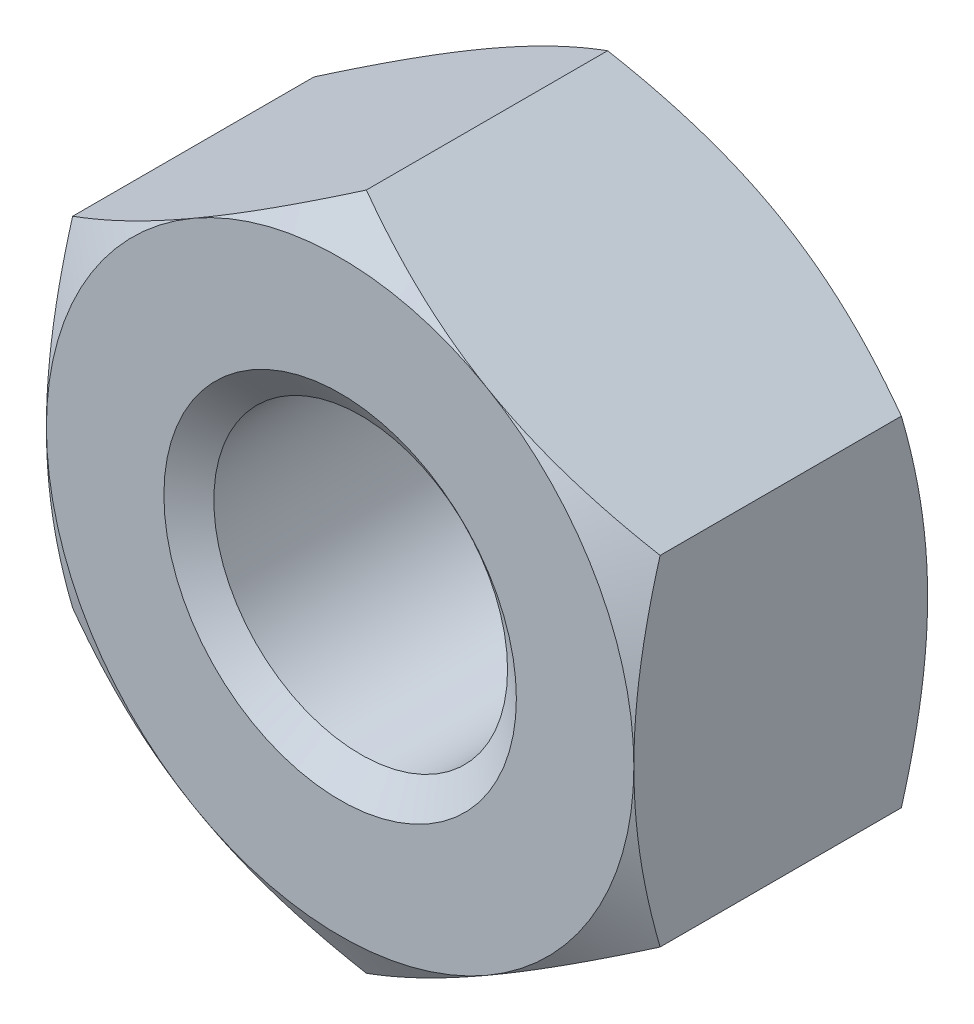
ISO-10303-21;
HEADER;
FILE_DESCRIPTION(('STEP AP214'),'2;1');
FILE_NAME('part.step','',(''),(''),'','','');
FILE_SCHEMA(('AUTOMOTIVE_DESIGN { 1 0 10303 214 1 1 1 1 }'));
ENDSEC;
DATA;
#1=APPLICATION_CONTEXT('core data for automotive mechanical design processes');
#2=APPLICATION_PROTOCOL_DEFINITION('international standard','automotive_design',2000,#1);
#3=PRODUCT_CONTEXT('',#1,'mechanical');
#4=PRODUCT('Part','Part','',(#3));
#5=PRODUCT_RELATED_PRODUCT_CATEGORY('part','',(#4));
#6=PRODUCT_DEFINITION_FORMATION('','',#4);
#7=PRODUCT_DEFINITION_CONTEXT('part definition',#1,'design');
#8=PRODUCT_DEFINITION('design','',#6,#7);
#9=PRODUCT_DEFINITION_SHAPE('','',#8);
#10=(LENGTH_UNIT() NAMED_UNIT(*) SI_UNIT(.MILLI.,.METRE.));
#11=(NAMED_UNIT(*) PLANE_ANGLE_UNIT() SI_UNIT($,.RADIAN.));
#12=(NAMED_UNIT(*) SI_UNIT($,.STERADIAN.) SOLID_ANGLE_UNIT());
#13=UNCERTAINTY_MEASURE_WITH_UNIT(LENGTH_MEASURE(1.E-05),#10,'distance_accuracy_value','');
#14=(GEOMETRIC_REPRESENTATION_CONTEXT(3) GLOBAL_UNCERTAINTY_ASSIGNED_CONTEXT((#13)) GLOBAL_UNIT_ASSIGNED_CONTEXT((#10,
#11,#12)) REPRESENTATION_CONTEXT('',''));
#15=CARTESIAN_POINT('',(0.,0.,0.));
#16=DIRECTION('',(0.,0.,1.));
#17=DIRECTION('',(1.,0.,0.));
#18=AXIS2_PLACEMENT_3D('',#15,#16,#17);
#19=CARTESIAN_POINT('',(0.,0.,-5.));
#20=DIRECTION('',(0.,0.,1.));
#21=DIRECTION('',(1.,0.,0.));
#22=AXIS2_PLACEMENT_3D('',#19,#20,#21);
#23=CYLINDRICAL_SURFACE('',#22,2.5);
#24=CARTESIAN_POINT('',(0.,0.,-0.350103769104855));
#25=DIRECTION('',(0.,0.,1.));
#26=DIRECTION('',(1.,0.,0.));
#27=AXIS2_PLACEMENT_3D('',#24,#25,#26);
#28=CIRCLE('',#27,2.5);
#29=CARTESIAN_POINT('',(2.5,0.,-0.350103769104855));
#30=VERTEX_POINT('',#29);
#31=EDGE_CURVE('E341',#30,#30,#28,.F.);
#32=ORIENTED_EDGE('',*,*,#31,.F.);
#33=EDGE_LOOP('',(#32));
#34=FACE_BOUND('',#33,.T.);
#35=CARTESIAN_POINT('',(0.,0.,-4.62449623089514));
#36=DIRECTION('',(0.,0.,-1.));
#37=DIRECTION('',(-1.,0.,0.));
#38=AXIS2_PLACEMENT_3D('',#35,#36,#37);
#39=CIRCLE('',#38,2.5);
#40=CARTESIAN_POINT('',(-2.5,0.,-4.62449623089514));
#41=VERTEX_POINT('',#40);
#42=EDGE_CURVE('E61',#41,#41,#39,.F.);
#43=ORIENTED_EDGE('',*,*,#42,.F.);
#44=EDGE_LOOP('',(#43));
#45=FACE_BOUND('',#44,.T.);
#46=ADVANCED_FACE('F55',(#34,#45),#23,.F.);
#47=CARTESIAN_POINT('',(0.,5.77350269189626,-5.));
#48=DIRECTION('',(-0.5,0.866025403784439,0.));
#49=DIRECTION('',(-0.866025403784439,-0.5,0.));
#50=AXIS2_PLACEMENT_3D('',#47,#48,#49);
#51=PLANE('',#50);
#52=DIRECTION('',(0.,0.,1.));
#53=VECTOR('',#52,1.);
#54=CARTESIAN_POINT('',(-5.,2.88675134594813,-5.));
#55=LINE('',#54,#53);
#56=CARTESIAN_POINT('',(-5.,2.88675134594813,-4.55341801261479));
#57=VERTEX_POINT('',#56);
#58=CARTESIAN_POINT('',(-5.,2.88675134594813,-0.446581987385205));
#59=VERTEX_POINT('',#58);
#60=EDGE_CURVE('E423',#57,#59,#55,.T.);
#61=ORIENTED_EDGE('',*,*,#60,.T.);
#62=CARTESIAN_POINT('',(-5.0002,2.88663587589429,-0.446648656051832));
#63=CARTESIAN_POINT('',(-4.78046540547482,3.01349970319368,-0.373386567637637));
#64=CARTESIAN_POINT('',(-4.55885141554042,3.14144859993849,-0.306751321918094));
#65=CARTESIAN_POINT('',(-4.11178600454649,3.39956193532121,-0.190438991010811));
#66=CARTESIAN_POINT('',(-3.88632664040922,3.52973095989718,-0.140803049915789));
#67=CARTESIAN_POINT('',(-3.43816769477649,3.78847564779798,-0.0635510254186974));
#68=CARTESIAN_POINT('',(-3.21553790689581,3.91701101576052,-0.0354203782834889));
#69=CARTESIAN_POINT('',(-2.88081009815336,4.11026620624323,-0.0101949219536839));
#70=CARTESIAN_POINT('',(-2.76915780319494,4.17472868879311,-0.00461345976948332));
#71=CARTESIAN_POINT('',(-2.5457500293262,4.30371322717528,0.000797783248530318));
#72=CARTESIAN_POINT('',(-2.43399455370968,4.36823528110589,0.000627741741796967));
#73=CARTESIAN_POINT('',(-2.12781576914936,4.54500768479195,-0.00775363179203663));
#74=CARTESIAN_POINT('',(-1.93349391403278,4.65719946015293,-0.0218297718972518));
#75=CARTESIAN_POINT('',(-1.54613989800229,4.88083840557981,-0.0664652571094316));
#76=CARTESIAN_POINT('',(-1.35310909862843,4.9922847895602,-0.0970398601475091));
#77=CARTESIAN_POINT('',(-0.964974657525143,5.21637431361295,-0.173468493621166));
#78=CARTESIAN_POINT('',(-0.769920001358262,5.32898917185759,-0.219646378878682));
#79=CARTESIAN_POINT('',(-0.38271965464123,5.55253939626498,-0.324451794491937));
#80=CARTESIAN_POINT('',(-0.190569004591912,5.66347762579592,-0.383054703437378));
#81=CARTESIAN_POINT('',(0.000200000000000614,5.7736181619501,-0.446648656051833));
#82=B_SPLINE_CURVE_WITH_KNOTS('',3,(#62,#63,#64,#65,#66,#67,#68,#69,#70,#71,#72,#73,#74,#75,#76,
#77,#78,#79,#80,#81),.UNSPECIFIED.,.F.,.F.,(4,2,2,2,2,2,2,2,2,4),(0.,0.792555841363092,
1.58701660053334,2.36181537487281,2.74884076077326,3.13585419177295,3.8096236259968,
4.4840172390119,5.17336882348929,5.86136694793725),.UNSPECIFIED.);
#83=CARTESIAN_POINT('',(-2.5,4.33012701892219,0.));
#84=VERTEX_POINT('',#83);
#85=EDGE_CURVE('E90',#59,#84,#82,.T.);
#86=ORIENTED_EDGE('',*,*,#85,.T.);
#87=CARTESIAN_POINT('',(0.,5.77350269189626,-0.446581987385206));
#88=VERTEX_POINT('',#87);
#89=EDGE_CURVE('E523',#84,#88,#82,.T.);
#90=ORIENTED_EDGE('',*,*,#89,.T.);
#91=DIRECTION('',(0.,0.,1.));
#92=VECTOR('',#91,1.);
#93=CARTESIAN_POINT('',(0.,5.77350269189626,-5.));
#94=LINE('',#93,#92);
#95=CARTESIAN_POINT('',(0.,5.77350269189626,-4.55341801261479));
#96=VERTEX_POINT('',#95);
#97=EDGE_CURVE('E200',#96,#88,#94,.T.);
#98=ORIENTED_EDGE('',*,*,#97,.F.);
#99=CARTESIAN_POINT('',(-5.0002,2.88663587589429,-4.55335134394817));
#100=CARTESIAN_POINT('',(-4.78046540547481,3.01349970319368,-4.62661343236236));
#101=CARTESIAN_POINT('',(-4.55885141554042,3.14144859993849,-4.69324867808191));
#102=CARTESIAN_POINT('',(-4.11178600454649,3.39956193532121,-4.80956100898919));
#103=CARTESIAN_POINT('',(-3.88632664040922,3.52973095989718,-4.85919695008421));
#104=CARTESIAN_POINT('',(-3.43816769477649,3.78847564779798,-4.9364489745813));
#105=CARTESIAN_POINT('',(-3.21553790689581,3.91701101576052,-4.96457962171651));
#106=CARTESIAN_POINT('',(-2.88081009815336,4.11026620624323,-4.98980507804632));
#107=CARTESIAN_POINT('',(-2.76915780319494,4.17472868879311,-4.99538654023052));
#108=CARTESIAN_POINT('',(-2.5457500293262,4.30371322717528,-5.00079778324853));
#109=CARTESIAN_POINT('',(-2.43399455370968,4.36823528110589,-5.0006277417418));
#110=CARTESIAN_POINT('',(-2.12781576914936,4.54500768479195,-4.99224636820796));
#111=CARTESIAN_POINT('',(-1.93349391403278,4.65719946015293,-4.97817022810275));
#112=CARTESIAN_POINT('',(-1.54613989800229,4.88083840557981,-4.93353474289057));
#113=CARTESIAN_POINT('',(-1.35310909862843,4.9922847895602,-4.90296013985249));
#114=CARTESIAN_POINT('',(-0.964974657525144,5.21637431361295,-4.82653150637883));
#115=CARTESIAN_POINT('',(-0.769920001358262,5.32898917185759,-4.78035362112132));
#116=CARTESIAN_POINT('',(-0.38271965464123,5.55253939626498,-4.67554820550806));
#117=CARTESIAN_POINT('',(-0.190569004591912,5.66347762579592,-4.61694529656262));
#118=CARTESIAN_POINT('',(0.000200000000000359,5.7736181619501,-4.55335134394817));
#119=B_SPLINE_CURVE_WITH_KNOTS('',3,(#99,#100,#101,#102,#103,#104,#105,#106,#107,#108,#109,#110,
#111,#112,#113,#114,#115,#116,#117,#118),.UNSPECIFIED.,.F.,.F.,(4,2,2,2,2,2,2,2,2,4),(0.,
0.792555841363092,1.58701660053334,2.36181537487281,2.74884076077326,3.13585419177295,
3.8096236259968,4.4840172390119,5.17336882348929,5.86136694793726),.UNSPECIFIED.);
#120=CARTESIAN_POINT('',(-2.5,4.33012701892219,-5.));
#121=VERTEX_POINT('',#120);
#122=EDGE_CURVE('E429',#121,#96,#119,.T.);
#123=ORIENTED_EDGE('',*,*,#122,.F.);
#124=EDGE_CURVE('E446',#57,#121,#119,.T.);
#125=ORIENTED_EDGE('',*,*,#124,.F.);
#126=EDGE_LOOP('',(#61,#86,#90,#98,#123,#125));
#127=FACE_BOUND('',#126,.T.);
#128=ADVANCED_FACE('F58',(#127),#51,.T.);
#129=CARTESIAN_POINT('',(5.,2.88675134594813,-5.));
#130=DIRECTION('',(0.500000000000001,0.866025403784438,0.));
#131=DIRECTION('',(-0.866025403784438,0.500000000000001,0.));
#132=AXIS2_PLACEMENT_3D('',#129,#130,#131);
#133=PLANE('',#132);
#134=ORIENTED_EDGE('',*,*,#97,.T.);
#135=CARTESIAN_POINT('',(-0.000199999999999281,5.7736181619501,-0.446648656051833));
#136=CARTESIAN_POINT('',(0.219534594525186,5.64675433465071,-0.373386567637638));
#137=CARTESIAN_POINT('',(0.441148584459582,5.5188054379059,-0.306751321918095));
#138=CARTESIAN_POINT('',(0.888213995453515,5.26069210252318,-0.190438991010812));
#139=CARTESIAN_POINT('',(1.11367335959078,5.13052307794721,-0.14080304991579));
#140=CARTESIAN_POINT('',(1.56183230522351,4.87177839004641,-0.063551025418698));
#141=CARTESIAN_POINT('',(1.7844620931042,4.74324302208387,-0.0354203782834893));
#142=CARTESIAN_POINT('',(2.11918990184665,4.54998783160116,-0.0101949219536843));
#143=CARTESIAN_POINT('',(2.23084219680507,4.48552534905128,-0.00461345976948372));
#144=CARTESIAN_POINT('',(2.4542499706738,4.35654081066911,0.000797783248529964));
#145=CARTESIAN_POINT('',(2.56600544629032,4.2920187567385,0.000627741741796721));
#146=CARTESIAN_POINT('',(2.87218423085064,4.11524635305244,-0.00775363179203655));
#147=CARTESIAN_POINT('',(3.06650608596722,4.00305457769146,-0.0218297718972515));
#148=CARTESIAN_POINT('',(3.45386010199771,3.77941563226457,-0.0664652571094311));
#149=CARTESIAN_POINT('',(3.64689090137157,3.66796924828418,-0.0970398601475088));
#150=CARTESIAN_POINT('',(4.03502534247486,3.44387972423144,-0.173468493621165));
#151=CARTESIAN_POINT('',(4.23007999864174,3.3312648659868,-0.219646378878681));
#152=CARTESIAN_POINT('',(4.61728034535877,3.1077146415794,-0.324451794491936));
#153=CARTESIAN_POINT('',(4.80943099540809,2.99677641204847,-0.383054703437376));
#154=CARTESIAN_POINT('',(5.0002,2.88663587589429,-0.446648656051831));
#155=B_SPLINE_CURVE_WITH_KNOTS('',3,(#135,#136,#137,#138,#139,#140,#141,#142,#143,#144,#145,
#146,#147,#148,#149,#150,#151,#152,#153,#154),.UNSPECIFIED.,.F.,.F.,(4,2,2,2,2,2,2,2,2,4),(0.,
0.792555841363092,1.58701660053334,2.36181537487281,2.74884076077326,3.13585419177295,
3.8096236259968,4.4840172390119,5.17336882348929,5.86136694793725),.UNSPECIFIED.);
#156=CARTESIAN_POINT('',(2.5,4.33012701892219,0.));
#157=VERTEX_POINT('',#156);
#158=EDGE_CURVE('E191',#88,#157,#155,.T.);
#159=ORIENTED_EDGE('',*,*,#158,.T.);
#160=CARTESIAN_POINT('',(5.,2.88675134594813,-0.446581987385206));
#161=VERTEX_POINT('',#160);
#162=EDGE_CURVE('E176',#157,#161,#155,.T.);
#163=ORIENTED_EDGE('',*,*,#162,.T.);
#164=DIRECTION('',(0.,0.,1.));
#165=VECTOR('',#164,1.);
#166=CARTESIAN_POINT('',(5.,2.88675134594813,-5.));
#167=LINE('',#166,#165);
#168=CARTESIAN_POINT('',(5.,2.88675134594813,-4.55341801261479));
#169=VERTEX_POINT('',#168);
#170=EDGE_CURVE('E190',#169,#161,#167,.T.);
#171=ORIENTED_EDGE('',*,*,#170,.F.);
#172=CARTESIAN_POINT('',(-0.000199999999999266,5.7736181619501,-4.55335134394817));
#173=CARTESIAN_POINT('',(0.219534594525186,5.64675433465071,-4.62661343236236));
#174=CARTESIAN_POINT('',(0.441148584459582,5.5188054379059,-4.6932486780819));
#175=CARTESIAN_POINT('',(0.888213995453515,5.26069210252318,-4.80956100898919));
#176=CARTESIAN_POINT('',(1.11367335959078,5.13052307794721,-4.85919695008421));
#177=CARTESIAN_POINT('',(1.56183230522351,4.87177839004641,-4.9364489745813));
#178=CARTESIAN_POINT('',(1.78446209310419,4.74324302208387,-4.96457962171651));
#179=CARTESIAN_POINT('',(2.11918990184664,4.54998783160116,-4.98980507804631));
#180=CARTESIAN_POINT('',(2.23084219680506,4.48552534905128,-4.99538654023052));
#181=CARTESIAN_POINT('',(2.4542499706738,4.35654081066911,-5.00079778324853));
#182=CARTESIAN_POINT('',(2.56600544629032,4.2920187567385,-5.0006277417418));
#183=CARTESIAN_POINT('',(2.87218423085064,4.11524635305244,-4.99224636820796));
#184=CARTESIAN_POINT('',(3.06650608596722,4.00305457769146,-4.97817022810275));
#185=CARTESIAN_POINT('',(3.45386010199771,3.77941563226457,-4.93353474289057));
#186=CARTESIAN_POINT('',(3.64689090137157,3.66796924828418,-4.90296013985249));
#187=CARTESIAN_POINT('',(4.03502534247485,3.44387972423144,-4.82653150637883));
#188=CARTESIAN_POINT('',(4.23007999864174,3.3312648659868,-4.78035362112132));
#189=CARTESIAN_POINT('',(4.61728034535877,3.1077146415794,-4.67554820550806));
#190=CARTESIAN_POINT('',(4.80943099540809,2.99677641204847,-4.61694529656262));
#191=CARTESIAN_POINT('',(5.0002,2.88663587589429,-4.55335134394817));
#192=B_SPLINE_CURVE_WITH_KNOTS('',3,(#172,#173,#174,#175,#176,#177,#178,#179,#180,#181,#182,
#183,#184,#185,#186,#187,#188,#189,#190,#191),.UNSPECIFIED.,.F.,.F.,(4,2,2,2,2,2,2,2,2,4),(0.,
0.792555841363092,1.58701660053334,2.36181537487281,2.74884076077326,3.13585419177295,
3.8096236259968,4.4840172390119,5.17336882348929,5.86136694793725),.UNSPECIFIED.);
#193=CARTESIAN_POINT('',(2.5,4.33012701892219,-5.));
#194=VERTEX_POINT('',#193);
#195=EDGE_CURVE('E404',#194,#169,#192,.T.);
#196=ORIENTED_EDGE('',*,*,#195,.F.);
#197=EDGE_CURVE('E508',#96,#194,#192,.T.);
#198=ORIENTED_EDGE('',*,*,#197,.F.);
#199=EDGE_LOOP('',(#134,#159,#163,#171,#196,#198));
#200=FACE_BOUND('',#199,.T.);
#201=ADVANCED_FACE('F188',(#200),#133,.T.);
#202=CARTESIAN_POINT('',(5.,2.88675134594813,-5.));
#203=DIRECTION('',(-1.,0.,0.));
#204=DIRECTION('',(0.,0.,1.));
#205=AXIS2_PLACEMENT_3D('',#202,#203,#204);
#206=PLANE('',#205);
#207=CARTESIAN_POINT('',(5.,-7.65608998744865,-2.3926335265508));
#208=CARTESIAN_POINT('',(5.,-7.43656171400166,-2.28654533817207));
#209=CARTESIAN_POINT('',(5.,-7.21651440170022,-2.18151175461596));
#210=CARTESIAN_POINT('',(5.,-6.77510105921518,-1.97415643363976));
#211=CARTESIAN_POINT('',(5.,-6.55373480873053,-1.87183516574569));
#212=CARTESIAN_POINT('',(5.,-6.10820714710357,-1.66996807853491));
#213=CARTESIAN_POINT('',(5.,-5.88403698971124,-1.57044149281731));
#214=CARTESIAN_POINT('',(5.,-5.43385418074677,-1.37566323278682));
#215=CARTESIAN_POINT('',(5.,-5.20784162594278,-1.28041133564243));
#216=CARTESIAN_POINT('',(5.,-4.75080884782756,-1.09418830918942));
#217=CARTESIAN_POINT('',(5.,-4.51976121099505,-1.0032840909987));
#218=CARTESIAN_POINT('',(5.,-4.054940534221,-0.828595302971951));
#219=CARTESIAN_POINT('',(5.,-3.82116719434025,-0.744811525247653));
#220=CARTESIAN_POINT('',(5.,-3.35100416711889,-0.58661463236462));
#221=CARTESIAN_POINT('',(5.,-3.11462125088188,-0.512181595225271));
#222=CARTESIAN_POINT('',(5.,-2.63849247870023,-0.375104393872377));
#223=CARTESIAN_POINT('',(5.,-2.3987477121033,-0.312456501596949));
#224=CARTESIAN_POINT('',(5.,-1.91574303714497,-0.201987753994869));
#225=CARTESIAN_POINT('',(5.,-1.672482210841,-0.154170846558642));
#226=CARTESIAN_POINT('',(5.,-1.18299359688664,-0.0765955557924025));
#227=CARTESIAN_POINT('',(5.,-0.936765806613278,-0.0468371884284092));
#228=CARTESIAN_POINT('',(5.,-0.567032279323844,-0.0176512015862964));
#229=CARTESIAN_POINT('',(5.,-0.444105297658536,-0.0104963190599469));
#230=CARTESIAN_POINT('',(5.,-0.198053005238562,-0.00139545226904073));
#231=CARTESIAN_POINT('',(5.,-0.0749276970802251,0.000550599639614557));
#232=CARTESIAN_POINT('',(5.,0.171257999892357,-0.000818470345664077));
#233=CARTESIAN_POINT('',(5.,0.294318397227092,-0.00413211431301171));
#234=CARTESIAN_POINT('',(5.,0.540192730788844,-0.0159365972827602));
#235=CARTESIAN_POINT('',(5.,0.663006654263487,-0.0244276975701651));
#236=CARTESIAN_POINT('',(5.,0.960681872881669,-0.0511063802753011));
#237=CARTESIAN_POINT('',(5.,1.1353143627994,-0.0718889676982867));
#238=CARTESIAN_POINT('',(5.,1.48321675799389,-0.122765655722695));
#239=CARTESIAN_POINT('',(5.,1.65648647841236,-0.152860997990034));
#240=CARTESIAN_POINT('',(5.,2.00155426058699,-0.221298792011551));
#241=CARTESIAN_POINT('',(5.,2.17335067370373,-0.259649477486405));
#242=CARTESIAN_POINT('',(5.,2.51518168221054,-0.343428305385012));
#243=CARTESIAN_POINT('',(5.,2.6852163841931,-0.388856016914002));
#244=CARTESIAN_POINT('',(5.,3.02770318928892,-0.486887782054293));
#245=CARTESIAN_POINT('',(5.,3.20011248435312,-0.539640363823942));
#246=CARTESIAN_POINT('',(5.,3.54310870430177,-0.650357787302626));
#247=CARTESIAN_POINT('',(5.,3.71369679659714,-0.70831903390707));
#248=CARTESIAN_POINT('',(5.,4.05236610267974,-0.828256540728474));
#249=CARTESIAN_POINT('',(5.,4.22045602230056,-0.890208365426365));
#250=CARTESIAN_POINT('',(5.,4.55533171687448,-1.01774823413812));
#251=CARTESIAN_POINT('',(5.,4.72211693321415,-1.08333774778777));
#252=CARTESIAN_POINT('',(5.,4.88829623733356,-1.15038625817724));
#253=B_SPLINE_CURVE_WITH_KNOTS('',3,(#207,#208,#209,#210,#211,#212,#213,#214,#215,#216,#217,
#218,#219,#220,#221,#222,#223,#224,#225,#226,#227,#228,#229,#230,#231,#232,#233,#234,#235,#236,
#237,#238,#239,#240,#241,#242,#243,#244,#245,#246,#247,#248,#249,#250,#251,#252),.UNSPECIFIED.,
.F.,.F.,(4,2,2,2,2,2,2,2,2,2,2,2,2,2,2,2,2,2,2,2,2,2,4),(0.,0.731464740665351,1.46305528824908,
2.19883243307486,2.93457117856033,3.67934251246858,4.42419659013361,5.1674358087199,
5.91043951739339,6.65364083834807,7.39684281638516,7.76615414335457,8.13546067426611,
8.50466345177856,8.87388486298453,9.40118542949727,9.92855633110015,10.4564556797854,
10.9843228991235,11.525120280828,12.065547221064,12.6029322754131,13.1405360390026),.UNSPECIFIED.);
#254=CARTESIAN_POINT('',(5.,-2.88675134594813,-0.446581987385206));
#255=VERTEX_POINT('',#254);
#256=CARTESIAN_POINT('',(5.,0.,0.));
#257=VERTEX_POINT('',#256);
#258=EDGE_CURVE('E183',#255,#257,#253,.T.);
#259=ORIENTED_EDGE('',*,*,#258,.F.);
#260=DIRECTION('',(0.,0.,1.));
#261=VECTOR('',#260,1.);
#262=CARTESIAN_POINT('',(5.,-2.88675134594813,-5.));
#263=LINE('',#262,#261);
#264=CARTESIAN_POINT('',(5.,-2.88675134594813,-4.55341801261479));
#265=VERTEX_POINT('',#264);
#266=EDGE_CURVE('E201',#265,#255,#263,.T.);
#267=ORIENTED_EDGE('',*,*,#266,.F.);
#268=CARTESIAN_POINT('',(5.,-7.65608998744865,-2.6073664734492));
#269=CARTESIAN_POINT('',(5.,-7.43656171400166,-2.71345466182792));
#270=CARTESIAN_POINT('',(5.,-7.21651440170021,-2.81848824538404));
#271=CARTESIAN_POINT('',(5.,-6.77510105921518,-3.02584356636023));
#272=CARTESIAN_POINT('',(5.,-6.55373480873052,-3.12816483425431));
#273=CARTESIAN_POINT('',(5.,-6.10820714710357,-3.33003192146509));
#274=CARTESIAN_POINT('',(5.,-5.88403698971124,-3.42955850718269));
#275=CARTESIAN_POINT('',(5.,-5.43385418074677,-3.62433676721318));
#276=CARTESIAN_POINT('',(5.,-5.20784162594278,-3.71958866435757));
#277=CARTESIAN_POINT('',(5.,-4.75080884782755,-3.90581169081058));
#278=CARTESIAN_POINT('',(5.,-4.51976121099505,-3.9967159090013));
#279=CARTESIAN_POINT('',(5.,-4.05494053422099,-4.17140469702805));
#280=CARTESIAN_POINT('',(5.,-3.82116719434024,-4.25518847475235));
#281=CARTESIAN_POINT('',(5.,-3.35100416711889,-4.41338536763538));
#282=CARTESIAN_POINT('',(5.,-3.11462125088187,-4.48781840477473));
#283=CARTESIAN_POINT('',(5.,-2.63849247870023,-4.62489560612762));
#284=CARTESIAN_POINT('',(5.,-2.3987477121033,-4.68754349840305));
#285=CARTESIAN_POINT('',(5.,-1.91574303714497,-4.79801224600513));
#286=CARTESIAN_POINT('',(5.,-1.672482210841,-4.84582915344136));
#287=CARTESIAN_POINT('',(5.,-1.18299359688664,-4.9234044442076));
#288=CARTESIAN_POINT('',(5.,-0.936765806613279,-4.95316281157159));
#289=CARTESIAN_POINT('',(5.,-0.567032279323846,-4.9823487984137));
#290=CARTESIAN_POINT('',(5.,-0.444105297658537,-4.98950368094005));
#291=CARTESIAN_POINT('',(5.,-0.198053005238563,-4.99860454773096));
#292=CARTESIAN_POINT('',(5.,-0.0749276970802267,-5.00055059963961));
#293=CARTESIAN_POINT('',(5.,0.171257999892355,-4.99918152965434));
#294=CARTESIAN_POINT('',(5.,0.29431839722709,-4.99586788568699));
#295=CARTESIAN_POINT('',(5.,0.540192730788843,-4.98406340271724));
#296=CARTESIAN_POINT('',(5.,0.663006654263486,-4.97557230242983));
#297=CARTESIAN_POINT('',(5.,0.960681872881669,-4.9488936197247));
#298=CARTESIAN_POINT('',(5.,1.1353143627994,-4.92811103230171));
#299=CARTESIAN_POINT('',(5.,1.48321675799389,-4.8772343442773));
#300=CARTESIAN_POINT('',(5.,1.65648647841236,-4.84713900200996));
#301=CARTESIAN_POINT('',(5.,2.00155426058699,-4.77870120798845));
#302=CARTESIAN_POINT('',(5.,2.17335067370373,-4.74035052251359));
#303=CARTESIAN_POINT('',(5.,2.51518168221054,-4.65657169461499));
#304=CARTESIAN_POINT('',(5.,2.6852163841931,-4.611143983086));
#305=CARTESIAN_POINT('',(5.,3.02770318928892,-4.51311221794571));
#306=CARTESIAN_POINT('',(5.,3.20011248435312,-4.46035963617606));
#307=CARTESIAN_POINT('',(5.,3.54310870430177,-4.34964221269737));
#308=CARTESIAN_POINT('',(5.,3.71369679659714,-4.29168096609293));
#309=CARTESIAN_POINT('',(5.,4.05236610267973,-4.17174345927153));
#310=CARTESIAN_POINT('',(5.,4.22045602230055,-4.10979163457363));
#311=CARTESIAN_POINT('',(5.,4.55533171687448,-3.98225176586188));
#312=CARTESIAN_POINT('',(5.,4.72211693321414,-3.91666225221223));
#313=CARTESIAN_POINT('',(5.,4.88829623733355,-3.84961374182276));
#314=B_SPLINE_CURVE_WITH_KNOTS('',3,(#268,#269,#270,#271,#272,#273,#274,#275,#276,#277,#278,
#279,#280,#281,#282,#283,#284,#285,#286,#287,#288,#289,#290,#291,#292,#293,#294,#295,#296,#297,
#298,#299,#300,#301,#302,#303,#304,#305,#306,#307,#308,#309,#310,#311,#312,#313),.UNSPECIFIED.,
.F.,.F.,(4,2,2,2,2,2,2,2,2,2,2,2,2,2,2,2,2,2,2,2,2,2,4),(0.,0.731464740665352,1.46305528824909,
2.19883243307486,2.93457117856034,3.67934251246858,4.42419659013362,5.1674358087199,
5.91043951739339,6.65364083834806,7.39684281638516,7.76615414335456,8.13546067426611,
8.50466345177856,8.87388486298453,9.40118542949727,9.92855633110015,10.4564556797854,
10.9843228991235,11.525120280828,12.065547221064,12.6029322754131,13.1405360390026),.UNSPECIFIED.);
#315=CARTESIAN_POINT('',(5.,0.,-5.));
#316=VERTEX_POINT('',#315);
#317=EDGE_CURVE('E452',#265,#316,#314,.T.);
#318=ORIENTED_EDGE('',*,*,#317,.T.);
#319=EDGE_CURVE('E198',#316,#169,#314,.T.);
#320=ORIENTED_EDGE('',*,*,#319,.T.);
#321=ORIENTED_EDGE('',*,*,#170,.T.);
#322=EDGE_CURVE('E173',#257,#161,#253,.T.);
#323=ORIENTED_EDGE('',*,*,#322,.F.);
#324=EDGE_LOOP('',(#259,#267,#318,#320,#321,#323));
#325=FACE_BOUND('',#324,.T.);
#326=ADVANCED_FACE('F195',(#325),#206,.F.);
#327=CARTESIAN_POINT('',(0.,-5.77350269189626,-5.));
#328=DIRECTION('',(0.5,-0.866025403784439,0.));
#329=DIRECTION('',(0.866025403784439,0.5,0.));
#330=AXIS2_PLACEMENT_3D('',#327,#328,#329);
#331=PLANE('',#330);
#332=ORIENTED_EDGE('',*,*,#266,.T.);
#333=CARTESIAN_POINT('',(5.0002,-2.88663587589429,-0.446648656051833));
#334=CARTESIAN_POINT('',(4.78046540547482,-3.01349970319368,-0.373386567637639));
#335=CARTESIAN_POINT('',(4.55885141554042,-3.14144859993849,-0.306751321918095));
#336=CARTESIAN_POINT('',(4.11178600454649,-3.39956193532121,-0.190438991010813));
#337=CARTESIAN_POINT('',(3.88632664040922,-3.52973095989718,-0.14080304991579));
#338=CARTESIAN_POINT('',(3.43816769477649,-3.78847564779798,-0.0635510254186991));
#339=CARTESIAN_POINT('',(3.2155379068958,-3.91701101576052,-0.0354203782834908));
#340=CARTESIAN_POINT('',(2.88081009815336,-4.11026620624323,-0.0101949219536858));
#341=CARTESIAN_POINT('',(2.76915780319494,-4.17472868879311,-0.00461345976948508));
#342=CARTESIAN_POINT('',(2.5457500293262,-4.30371322717528,0.000797783248528572));
#343=CARTESIAN_POINT('',(2.43399455370968,-4.36823528110589,0.000627741741795142));
#344=CARTESIAN_POINT('',(2.12781576914936,-4.54500768479195,-0.00775363179203859));
#345=CARTESIAN_POINT('',(1.93349391403278,-4.65719946015293,-0.0218297718972538));
#346=CARTESIAN_POINT('',(1.54613989800229,-4.88083840557982,-0.0664652571094336));
#347=CARTESIAN_POINT('',(1.35310909862843,-4.99228478956021,-0.0970398601475113));
#348=CARTESIAN_POINT('',(0.964974657525143,-5.21637431361295,-0.173468493621168));
#349=CARTESIAN_POINT('',(0.769920001358262,-5.32898917185759,-0.219646378878685));
#350=CARTESIAN_POINT('',(0.38271965464123,-5.55253939626499,-0.32445179449194));
#351=CARTESIAN_POINT('',(0.190569004591912,-5.66347762579592,-0.38305470343738));
#352=CARTESIAN_POINT('',(-0.000200000000000662,-5.7736181619501,-0.446648656051835));
#353=B_SPLINE_CURVE_WITH_KNOTS('',3,(#333,#334,#335,#336,#337,#338,#339,#340,#341,#342,#343,
#344,#345,#346,#347,#348,#349,#350,#351,#352),.UNSPECIFIED.,.F.,.F.,(4,2,2,2,2,2,2,2,2,4),(0.,
0.792555841363091,1.58701660053334,2.36181537487281,2.74884076077326,3.13585419177295,
3.8096236259968,4.4840172390119,5.17336882348929,5.86136694793725),.UNSPECIFIED.);
#354=CARTESIAN_POINT('',(2.5,-4.33012701892219,0.));
#355=VERTEX_POINT('',#354);
#356=EDGE_CURVE('E233',#255,#355,#353,.T.);
#357=ORIENTED_EDGE('',*,*,#356,.T.);
#358=CARTESIAN_POINT('',(0.,-5.77350269189626,-0.446581987385206));
#359=VERTEX_POINT('',#358);
#360=EDGE_CURVE('E234',#355,#359,#353,.T.);
#361=ORIENTED_EDGE('',*,*,#360,.T.);
#362=DIRECTION('',(0.,0.,1.));
#363=VECTOR('',#362,1.);
#364=CARTESIAN_POINT('',(0.,-5.77350269189626,-5.));
#365=LINE('',#364,#363);
#366=CARTESIAN_POINT('',(0.,-5.77350269189626,-4.55341801261479));
#367=VERTEX_POINT('',#366);
#368=EDGE_CURVE('E210',#367,#359,#365,.T.);
#369=ORIENTED_EDGE('',*,*,#368,.F.);
#370=CARTESIAN_POINT('',(5.0002,-2.88663587589429,-4.55335134394817));
#371=CARTESIAN_POINT('',(4.78046540547481,-3.01349970319368,-4.62661343236236));
#372=CARTESIAN_POINT('',(4.55885141554042,-3.14144859993849,-4.6932486780819));
#373=CARTESIAN_POINT('',(4.11178600454649,-3.39956193532121,-4.80956100898919));
#374=CARTESIAN_POINT('',(3.88632664040923,-3.52973095989718,-4.85919695008421));
#375=CARTESIAN_POINT('',(3.43816769477649,-3.78847564779798,-4.9364489745813));
#376=CARTESIAN_POINT('',(3.21553790689581,-3.91701101576052,-4.96457962171651));
#377=CARTESIAN_POINT('',(2.88081009815336,-4.11026620624323,-4.98980507804631));
#378=CARTESIAN_POINT('',(2.76915780319494,-4.17472868879311,-4.99538654023052));
#379=CARTESIAN_POINT('',(2.5457500293262,-4.30371322717528,-5.00079778324853));
#380=CARTESIAN_POINT('',(2.43399455370968,-4.36823528110589,-5.00062774174179));
#381=CARTESIAN_POINT('',(2.12781576914936,-4.54500768479195,-4.99224636820796));
#382=CARTESIAN_POINT('',(1.93349391403278,-4.65719946015293,-4.97817022810275));
#383=CARTESIAN_POINT('',(1.54613989800229,-4.88083840557982,-4.93353474289056));
#384=CARTESIAN_POINT('',(1.35310909862843,-4.99228478956021,-4.90296013985249));
#385=CARTESIAN_POINT('',(0.964974657525143,-5.21637431361295,-4.82653150637883));
#386=CARTESIAN_POINT('',(0.769920001358262,-5.32898917185759,-4.78035362112131));
#387=CARTESIAN_POINT('',(0.38271965464123,-5.55253939626499,-4.67554820550806));
#388=CARTESIAN_POINT('',(0.190569004591912,-5.66347762579592,-4.61694529656262));
#389=CARTESIAN_POINT('',(-0.000200000000000445,-5.7736181619501,-4.55335134394816));
#390=B_SPLINE_CURVE_WITH_KNOTS('',3,(#370,#371,#372,#373,#374,#375,#376,#377,#378,#379,#380,
#381,#382,#383,#384,#385,#386,#387,#388,#389),.UNSPECIFIED.,.F.,.F.,(4,2,2,2,2,2,2,2,2,4),(0.,
0.792555841363092,1.58701660053334,2.36181537487281,2.74884076077326,3.13585419177295,
3.8096236259968,4.4840172390119,5.17336882348929,5.86136694793726),.UNSPECIFIED.);
#391=CARTESIAN_POINT('',(2.5,-4.33012701892219,-5.));
#392=VERTEX_POINT('',#391);
#393=EDGE_CURVE('E322',#392,#367,#390,.T.);
#394=ORIENTED_EDGE('',*,*,#393,.F.);
#395=EDGE_CURVE('E502',#265,#392,#390,.T.);
#396=ORIENTED_EDGE('',*,*,#395,.F.);
#397=EDGE_LOOP('',(#332,#357,#361,#369,#394,#396));
#398=FACE_BOUND('',#397,.T.);
#399=ADVANCED_FACE('F299',(#398),#331,.T.);
#400=CARTESIAN_POINT('',(-5.,-2.88675134594813,-5.));
#401=DIRECTION('',(-0.500000000000001,-0.866025403784438,0.));
#402=DIRECTION('',(0.866025403784438,-0.500000000000001,0.));
#403=AXIS2_PLACEMENT_3D('',#400,#401,#402);
#404=PLANE('',#403);
#405=ORIENTED_EDGE('',*,*,#368,.T.);
#406=CARTESIAN_POINT('',(0.000199999999999499,-5.7736181619501,-0.446648656051835));
#407=CARTESIAN_POINT('',(-0.219534594525186,-5.64675433465071,-0.37338656763764));
#408=CARTESIAN_POINT('',(-0.441148584459582,-5.5188054379059,-0.306751321918097));
#409=CARTESIAN_POINT('',(-0.888213995453515,-5.26069210252318,-0.190438991010814));
#410=CARTESIAN_POINT('',(-1.11367335959078,-5.13052307794721,-0.140803049915792));
#411=CARTESIAN_POINT('',(-1.56183230522351,-4.87177839004641,-0.0635510254186998));
#412=CARTESIAN_POINT('',(-1.7844620931042,-4.74324302208387,-0.0354203782834912));
#413=CARTESIAN_POINT('',(-2.11918990184665,-4.54998783160116,-0.0101949219536862));
#414=CARTESIAN_POINT('',(-2.23084219680507,-4.48552534905128,-0.00461345976948555));
#415=CARTESIAN_POINT('',(-2.4542499706738,-4.35654081066911,0.000797783248528294));
#416=CARTESIAN_POINT('',(-2.56600544629032,-4.2920187567385,0.000627741741795148));
#417=CARTESIAN_POINT('',(-2.87218423085064,-4.11524635305244,-0.00775363179203826));
#418=CARTESIAN_POINT('',(-3.06650608596722,-4.00305457769146,-0.0218297718972537));
#419=CARTESIAN_POINT('',(-3.45386010199771,-3.77941563226457,-0.0664652571094333));
#420=CARTESIAN_POINT('',(-3.64689090137157,-3.66796924828419,-0.0970398601475104));
#421=CARTESIAN_POINT('',(-4.03502534247486,-3.44387972423144,-0.173468493621166));
#422=CARTESIAN_POINT('',(-4.23007999864174,-3.3312648659868,-0.219646378878683));
#423=CARTESIAN_POINT('',(-4.61728034535877,-3.10771464157941,-0.324451794491937));
#424=CARTESIAN_POINT('',(-4.80943099540809,-2.99677641204847,-0.383054703437378));
#425=CARTESIAN_POINT('',(-5.0002,-2.88663587589429,-0.446648656051832));
#426=B_SPLINE_CURVE_WITH_KNOTS('',3,(#406,#407,#408,#409,#410,#411,#412,#413,#414,#415,#416,
#417,#418,#419,#420,#421,#422,#423,#424,#425),.UNSPECIFIED.,.F.,.F.,(4,2,2,2,2,2,2,2,2,4),(0.,
0.792555841363093,1.58701660053334,2.36181537487281,2.74884076077326,3.13585419177296,
3.8096236259968,4.4840172390119,5.17336882348929,5.86136694793725),.UNSPECIFIED.);
#427=CARTESIAN_POINT('',(-2.5,-4.33012701892219,0.));
#428=VERTEX_POINT('',#427);
#429=EDGE_CURVE('E288',#359,#428,#426,.T.);
#430=ORIENTED_EDGE('',*,*,#429,.T.);
#431=CARTESIAN_POINT('',(-5.,-2.88675134594813,-0.446581987385206));
#432=VERTEX_POINT('',#431);
#433=EDGE_CURVE('E279',#428,#432,#426,.T.);
#434=ORIENTED_EDGE('',*,*,#433,.T.);
#435=DIRECTION('',(0.,0.,1.));
#436=VECTOR('',#435,1.);
#437=CARTESIAN_POINT('',(-5.,-2.88675134594813,-5.));
#438=LINE('',#437,#436);
#439=CARTESIAN_POINT('',(-5.,-2.88675134594813,-4.55341801261479));
#440=VERTEX_POINT('',#439);
#441=EDGE_CURVE('E428',#440,#432,#438,.T.);
#442=ORIENTED_EDGE('',*,*,#441,.F.);
#443=CARTESIAN_POINT('',(0.000199999999999499,-5.7736181619501,-4.55335134394816));
#444=CARTESIAN_POINT('',(-0.219534594525186,-5.64675433465071,-4.62661343236236));
#445=CARTESIAN_POINT('',(-0.441148584459582,-5.5188054379059,-4.6932486780819));
#446=CARTESIAN_POINT('',(-0.888213995453516,-5.26069210252318,-4.80956100898918));
#447=CARTESIAN_POINT('',(-1.11367335959078,-5.13052307794721,-4.85919695008421));
#448=CARTESIAN_POINT('',(-1.56183230522351,-4.87177839004641,-4.9364489745813));
#449=CARTESIAN_POINT('',(-1.7844620931042,-4.74324302208387,-4.96457962171651));
#450=CARTESIAN_POINT('',(-2.11918990184665,-4.54998783160116,-4.98980507804631));
#451=CARTESIAN_POINT('',(-2.23084219680507,-4.48552534905128,-4.99538654023051));
#452=CARTESIAN_POINT('',(-2.4542499706738,-4.35654081066911,-5.00079778324853));
#453=CARTESIAN_POINT('',(-2.56600544629032,-4.2920187567385,-5.00062774174179));
#454=CARTESIAN_POINT('',(-2.87218423085064,-4.11524635305244,-4.99224636820796));
#455=CARTESIAN_POINT('',(-3.06650608596722,-4.00305457769146,-4.97817022810275));
#456=CARTESIAN_POINT('',(-3.45386010199771,-3.77941563226457,-4.93353474289057));
#457=CARTESIAN_POINT('',(-3.64689090137157,-3.66796924828418,-4.90296013985249));
#458=CARTESIAN_POINT('',(-4.03502534247486,-3.44387972423144,-4.82653150637883));
#459=CARTESIAN_POINT('',(-4.23007999864174,-3.3312648659868,-4.78035362112132));
#460=CARTESIAN_POINT('',(-4.61728034535877,-3.10771464157941,-4.67554820550806));
#461=CARTESIAN_POINT('',(-4.80943099540809,-2.99677641204847,-4.61694529656262));
#462=CARTESIAN_POINT('',(-5.0002,-2.88663587589429,-4.55335134394817));
#463=B_SPLINE_CURVE_WITH_KNOTS('',3,(#443,#444,#445,#446,#447,#448,#449,#450,#451,#452,#453,
#454,#455,#456,#457,#458,#459,#460,#461,#462),.UNSPECIFIED.,.F.,.F.,(4,2,2,2,2,2,2,2,2,4),(0.,
0.792555841363093,1.58701660053334,2.36181537487281,2.74884076077326,3.13585419177296,
3.8096236259968,4.4840172390119,5.17336882348929,5.86136694793725),.UNSPECIFIED.);
#464=CARTESIAN_POINT('',(-2.5,-4.33012701892219,-5.));
#465=VERTEX_POINT('',#464);
#466=EDGE_CURVE('E306',#465,#440,#463,.T.);
#467=ORIENTED_EDGE('',*,*,#466,.F.);
#468=EDGE_CURVE('E314',#367,#465,#463,.T.);
#469=ORIENTED_EDGE('',*,*,#468,.F.);
#470=EDGE_LOOP('',(#405,#430,#434,#442,#467,#469));
#471=FACE_BOUND('',#470,.T.);
#472=ADVANCED_FACE('F293',(#471),#404,.T.);
#473=CARTESIAN_POINT('',(-5.,2.88675134594813,-5.));
#474=DIRECTION('',(-1.,0.,0.));
#475=DIRECTION('',(0.,0.,1.));
#476=AXIS2_PLACEMENT_3D('',#473,#474,#475);
#477=PLANE('',#476);
#478=ORIENTED_EDGE('',*,*,#441,.T.);
#479=CARTESIAN_POINT('',(-5.,-7.65608998744865,-2.3926335265508));
#480=CARTESIAN_POINT('',(-5.,-7.43656171400166,-2.28654533817207));
#481=CARTESIAN_POINT('',(-5.,-7.21651440170021,-2.18151175461596));
#482=CARTESIAN_POINT('',(-5.,-6.77510105921518,-1.97415643363976));
#483=CARTESIAN_POINT('',(-5.,-6.55373480873052,-1.87183516574568));
#484=CARTESIAN_POINT('',(-5.,-6.10820714710356,-1.66996807853491));
#485=CARTESIAN_POINT('',(-5.,-5.88403698971124,-1.5704414928173));
#486=CARTESIAN_POINT('',(-5.,-5.43385418074677,-1.37566323278682));
#487=CARTESIAN_POINT('',(-5.,-5.20784162594278,-1.28041133564243));
#488=CARTESIAN_POINT('',(-5.,-4.75080884782755,-1.09418830918941));
#489=CARTESIAN_POINT('',(-5.,-4.51976121099505,-1.0032840909987));
#490=CARTESIAN_POINT('',(-5.,-4.05494053422099,-0.828595302971949));
#491=CARTESIAN_POINT('',(-5.,-3.82116719434024,-0.744811525247651));
#492=CARTESIAN_POINT('',(-5.,-3.35100416711889,-0.586614632364618));
#493=CARTESIAN_POINT('',(-5.,-3.11462125088187,-0.51218159522527));
#494=CARTESIAN_POINT('',(-5.,-2.63849247870023,-0.375104393872376));
#495=CARTESIAN_POINT('',(-5.,-2.3987477121033,-0.312456501596949));
#496=CARTESIAN_POINT('',(-5.,-1.91574303714497,-0.201987753994869));
#497=CARTESIAN_POINT('',(-5.,-1.67248221084099,-0.154170846558641));
#498=CARTESIAN_POINT('',(-5.,-1.18299359688664,-0.0765955557924019));
#499=CARTESIAN_POINT('',(-5.,-0.936765806613277,-0.0468371884284091));
#500=CARTESIAN_POINT('',(-5.,-0.567032279323843,-0.0176512015862964));
#501=CARTESIAN_POINT('',(-5.,-0.444105297658535,-0.0104963190599469));
#502=CARTESIAN_POINT('',(-5.,-0.19805300523856,-0.00139545226904072));
#503=CARTESIAN_POINT('',(-5.,-0.0749276970802239,0.000550599639614582));
#504=CARTESIAN_POINT('',(-5.,0.171257999892357,-0.000818470345664099));
#505=CARTESIAN_POINT('',(-5.,0.294318397227092,-0.00413211431301177));
#506=CARTESIAN_POINT('',(-5.,0.540192730788844,-0.0159365972827602));
#507=CARTESIAN_POINT('',(-5.,0.663006654263487,-0.0244276975701651));
#508=CARTESIAN_POINT('',(-5.,0.960681872881671,-0.0511063802753011));
#509=CARTESIAN_POINT('',(-5.,1.1353143627994,-0.071888967698287));
#510=CARTESIAN_POINT('',(-5.,1.48321675799389,-0.122765655722696));
#511=CARTESIAN_POINT('',(-5.,1.65648647841237,-0.152860997990035));
#512=CARTESIAN_POINT('',(-5.,2.001554260587,-0.221298792011553));
#513=CARTESIAN_POINT('',(-5.,2.17335067370374,-0.259649477486406));
#514=CARTESIAN_POINT('',(-5.,2.51518168221055,-0.343428305385013));
#515=CARTESIAN_POINT('',(-5.,2.68521638419311,-0.388856016914004));
#516=CARTESIAN_POINT('',(-5.,3.02770318928892,-0.486887782054295));
#517=CARTESIAN_POINT('',(-5.,3.20011248435312,-0.539640363823944));
#518=CARTESIAN_POINT('',(-5.,3.54310870430177,-0.650357787302628));
#519=CARTESIAN_POINT('',(-5.,3.71369679659715,-0.708319033907072));
#520=CARTESIAN_POINT('',(-5.,4.05236610267974,-0.828256540728476));
#521=CARTESIAN_POINT('',(-5.,4.22045602230056,-0.890208365426367));
#522=CARTESIAN_POINT('',(-5.,4.55533171687449,-1.01774823413812));
#523=CARTESIAN_POINT('',(-5.,4.72211693321415,-1.08333774778777));
#524=CARTESIAN_POINT('',(-5.,4.88829623733356,-1.15038625817725));
#525=B_SPLINE_CURVE_WITH_KNOTS('',3,(#479,#480,#481,#482,#483,#484,#485,#486,#487,#488,#489,
#490,#491,#492,#493,#494,#495,#496,#497,#498,#499,#500,#501,#502,#503,#504,#505,#506,#507,#508,
#509,#510,#511,#512,#513,#514,#515,#516,#517,#518,#519,#520,#521,#522,#523,#524),.UNSPECIFIED.,
.F.,.F.,(4,2,2,2,2,2,2,2,2,2,2,2,2,2,2,2,2,2,2,2,2,2,4),(0.,0.731464740665353,1.46305528824909,
2.19883243307486,2.93457117856034,3.67934251246858,4.42419659013362,5.1674358087199,
5.91043951739339,6.65364083834806,7.39684281638516,7.76615414335456,8.13546067426611,
8.50466345177856,8.87388486298453,9.40118542949727,9.92855633110015,10.4564556797854,
10.9843228991235,11.525120280828,12.065547221064,12.6029322754131,13.1405360390026),.UNSPECIFIED.);
#526=CARTESIAN_POINT('',(-5.,0.,0.));
#527=VERTEX_POINT('',#526);
#528=EDGE_CURVE('E289',#432,#527,#525,.T.);
#529=ORIENTED_EDGE('',*,*,#528,.T.);
#530=EDGE_CURVE('E271',#527,#59,#525,.T.);
#531=ORIENTED_EDGE('',*,*,#530,.T.);
#532=ORIENTED_EDGE('',*,*,#60,.F.);
#533=CARTESIAN_POINT('',(-5.,-7.65608998744865,-2.6073664734492));
#534=CARTESIAN_POINT('',(-5.,-7.43656171400166,-2.71345466182792));
#535=CARTESIAN_POINT('',(-5.,-7.21651440170021,-2.81848824538404));
#536=CARTESIAN_POINT('',(-5.,-6.77510105921518,-3.02584356636024));
#537=CARTESIAN_POINT('',(-5.,-6.55373480873052,-3.12816483425431));
#538=CARTESIAN_POINT('',(-5.,-6.10820714710356,-3.33003192146509));
#539=CARTESIAN_POINT('',(-5.,-5.88403698971124,-3.42955850718269));
#540=CARTESIAN_POINT('',(-5.,-5.43385418074677,-3.62433676721318));
#541=CARTESIAN_POINT('',(-5.,-5.20784162594278,-3.71958866435757));
#542=CARTESIAN_POINT('',(-5.,-4.75080884782756,-3.90581169081058));
#543=CARTESIAN_POINT('',(-5.,-4.51976121099505,-3.9967159090013));
#544=CARTESIAN_POINT('',(-5.,-4.05494053422099,-4.17140469702805));
#545=CARTESIAN_POINT('',(-5.,-3.82116719434024,-4.25518847475235));
#546=CARTESIAN_POINT('',(-5.,-3.35100416711889,-4.41338536763538));
#547=CARTESIAN_POINT('',(-5.,-3.11462125088187,-4.48781840477473));
#548=CARTESIAN_POINT('',(-5.,-2.63849247870023,-4.62489560612762));
#549=CARTESIAN_POINT('',(-5.,-2.3987477121033,-4.68754349840305));
#550=CARTESIAN_POINT('',(-5.,-1.91574303714497,-4.79801224600513));
#551=CARTESIAN_POINT('',(-5.,-1.67248221084099,-4.84582915344136));
#552=CARTESIAN_POINT('',(-5.,-1.18299359688664,-4.9234044442076));
#553=CARTESIAN_POINT('',(-5.,-0.936765806613278,-4.95316281157159));
#554=CARTESIAN_POINT('',(-5.,-0.567032279323844,-4.9823487984137));
#555=CARTESIAN_POINT('',(-5.,-0.444105297658536,-4.98950368094005));
#556=CARTESIAN_POINT('',(-5.,-0.198053005238562,-4.99860454773096));
#557=CARTESIAN_POINT('',(-5.,-0.0749276970802258,-5.00055059963961));
#558=CARTESIAN_POINT('',(-5.,0.171257999892356,-4.99918152965434));
#559=CARTESIAN_POINT('',(-5.,0.294318397227091,-4.99586788568699));
#560=CARTESIAN_POINT('',(-5.,0.540192730788844,-4.98406340271724));
#561=CARTESIAN_POINT('',(-5.,0.663006654263487,-4.97557230242983));
#562=CARTESIAN_POINT('',(-5.,0.960681872881671,-4.9488936197247));
#563=CARTESIAN_POINT('',(-5.,1.1353143627994,-4.92811103230171));
#564=CARTESIAN_POINT('',(-5.,1.48321675799389,-4.8772343442773));
#565=CARTESIAN_POINT('',(-5.,1.65648647841237,-4.84713900200996));
#566=CARTESIAN_POINT('',(-5.,2.00155426058699,-4.77870120798845));
#567=CARTESIAN_POINT('',(-5.,2.17335067370373,-4.74035052251359));
#568=CARTESIAN_POINT('',(-5.,2.51518168221054,-4.65657169461499));
#569=CARTESIAN_POINT('',(-5.,2.68521638419311,-4.611143983086));
#570=CARTESIAN_POINT('',(-5.,3.02770318928892,-4.51311221794571));
#571=CARTESIAN_POINT('',(-5.,3.20011248435312,-4.46035963617606));
#572=CARTESIAN_POINT('',(-5.,3.54310870430177,-4.34964221269737));
#573=CARTESIAN_POINT('',(-5.,3.71369679659714,-4.29168096609293));
#574=CARTESIAN_POINT('',(-5.,4.05236610267974,-4.17174345927153));
#575=CARTESIAN_POINT('',(-5.,4.22045602230056,-4.10979163457363));
#576=CARTESIAN_POINT('',(-5.,4.55533171687448,-3.98225176586188));
#577=CARTESIAN_POINT('',(-5.,4.72211693321414,-3.91666225221223));
#578=CARTESIAN_POINT('',(-5.,4.88829623733355,-3.84961374182275));
#579=B_SPLINE_CURVE_WITH_KNOTS('',3,(#533,#534,#535,#536,#537,#538,#539,#540,#541,#542,#543,
#544,#545,#546,#547,#548,#549,#550,#551,#552,#553,#554,#555,#556,#557,#558,#559,#560,#561,#562,
#563,#564,#565,#566,#567,#568,#569,#570,#571,#572,#573,#574,#575,#576,#577,#578),.UNSPECIFIED.,
.F.,.F.,(4,2,2,2,2,2,2,2,2,2,2,2,2,2,2,2,2,2,2,2,2,2,4),(0.,0.731464740665352,1.46305528824909,
2.19883243307486,2.93457117856034,3.67934251246858,4.42419659013361,5.16743580871989,
5.91043951739339,6.65364083834806,7.39684281638516,7.76615414335456,8.1354606742661,
8.50466345177856,8.87388486298453,9.40118542949727,9.92855633110015,10.4564556797854,
10.9843228991235,11.525120280828,12.065547221064,12.6029322754131,13.1405360390026),.UNSPECIFIED.);
#580=CARTESIAN_POINT('',(-5.,0.,-5.));
#581=VERTEX_POINT('',#580);
#582=EDGE_CURVE('E316',#581,#57,#579,.T.);
#583=ORIENTED_EDGE('',*,*,#582,.F.);
#584=EDGE_CURVE('E315',#440,#581,#579,.T.);
#585=ORIENTED_EDGE('',*,*,#584,.F.);
#586=EDGE_LOOP('',(#478,#529,#531,#532,#583,#585));
#587=FACE_BOUND('',#586,.T.);
#588=ADVANCED_FACE('F298',(#587),#477,.T.);
#589=CARTESIAN_POINT('',(-10.,0.,0.));
#590=DIRECTION('',(0.,0.,1.));
#591=DIRECTION('',(1.,0.,0.));
#592=AXIS2_PLACEMENT_3D('',#589,#590,#591);
#593=PLANE('',#592);
#594=CARTESIAN_POINT('',(0.,0.,0.));
#595=DIRECTION('',(0.,0.,1.));
#596=DIRECTION('',(1.,0.,0.));
#597=AXIS2_PLACEMENT_3D('',#594,#595,#596);
#598=CIRCLE('',#597,3.);
#599=CARTESIAN_POINT('',(3.,0.,0.));
#600=VERTEX_POINT('',#599);
#601=EDGE_CURVE('E337',#600,#600,#598,.T.);
#602=ORIENTED_EDGE('',*,*,#601,.F.);
#603=EDGE_LOOP('',(#602));
#604=FACE_BOUND('',#603,.T.);
#605=CARTESIAN_POINT('',(0.,0.,0.));
#606=DIRECTION('',(0.,0.,1.));
#607=DIRECTION('',(1.,0.,0.));
#608=AXIS2_PLACEMENT_3D('',#605,#606,#607);
#609=CIRCLE('',#608,5.);
#610=EDGE_CURVE('E69',#355,#257,#609,.T.);
#611=ORIENTED_EDGE('',*,*,#610,.T.);
#612=CARTESIAN_POINT('',(0.,0.,0.));
#613=DIRECTION('',(0.,0.,1.));
#614=DIRECTION('',(1.,0.,0.));
#615=AXIS2_PLACEMENT_3D('',#612,#613,#614);
#616=CIRCLE('',#615,5.);
#617=EDGE_CURVE('E79',#257,#157,#616,.T.);
#618=ORIENTED_EDGE('',*,*,#617,.T.);
#619=EDGE_CURVE('E13',#157,#84,#609,.T.);
#620=ORIENTED_EDGE('',*,*,#619,.T.);
#621=EDGE_CURVE('E67',#84,#527,#609,.T.);
#622=ORIENTED_EDGE('',*,*,#621,.T.);
#623=EDGE_CURVE('E583',#527,#428,#609,.T.);
#624=ORIENTED_EDGE('',*,*,#623,.T.);
#625=EDGE_CURVE('E354',#428,#355,#609,.T.);
#626=ORIENTED_EDGE('',*,*,#625,.T.);
#627=EDGE_LOOP('',(#611,#618,#620,#622,#624,#626));
#628=FACE_BOUND('',#627,.T.);
#629=ADVANCED_FACE('F396',(#604,#628),#593,.T.);
#630=CARTESIAN_POINT('',(-10.,0.,-5.));
#631=DIRECTION('',(0.,0.,1.));
#632=DIRECTION('',(1.,0.,0.));
#633=AXIS2_PLACEMENT_3D('',#630,#631,#632);
#634=PLANE('',#633);
#635=CARTESIAN_POINT('',(0.,0.,-5.));
#636=DIRECTION('',(0.,0.,1.));
#637=DIRECTION('',(1.,0.,0.));
#638=AXIS2_PLACEMENT_3D('',#635,#636,#637);
#639=CIRCLE('',#638,3.);
#640=CARTESIAN_POINT('',(3.,0.,-5.));
#641=VERTEX_POINT('',#640);
#642=EDGE_CURVE('E363',#641,#641,#639,.F.);
#643=ORIENTED_EDGE('',*,*,#642,.F.);
#644=EDGE_LOOP('',(#643));
#645=FACE_BOUND('',#644,.T.);
#646=CARTESIAN_POINT('',(0.,0.,-5.));
#647=DIRECTION('',(0.,0.,1.));
#648=DIRECTION('',(1.,0.,0.));
#649=AXIS2_PLACEMENT_3D('',#646,#647,#648);
#650=CIRCLE('',#649,5.);
#651=EDGE_CURVE('E414',#316,#194,#650,.T.);
#652=ORIENTED_EDGE('',*,*,#651,.F.);
#653=CARTESIAN_POINT('',(0.,0.,-5.));
#654=DIRECTION('',(0.,0.,1.));
#655=DIRECTION('',(1.,0.,0.));
#656=AXIS2_PLACEMENT_3D('',#653,#654,#655);
#657=CIRCLE('',#656,5.);
#658=EDGE_CURVE('E355',#316,#392,#657,.F.);
#659=ORIENTED_EDGE('',*,*,#658,.T.);
#660=EDGE_CURVE('E539',#392,#465,#657,.F.);
#661=ORIENTED_EDGE('',*,*,#660,.T.);
#662=EDGE_CURVE('E542',#465,#581,#657,.F.);
#663=ORIENTED_EDGE('',*,*,#662,.T.);
#664=EDGE_CURVE('E544',#581,#121,#657,.F.);
#665=ORIENTED_EDGE('',*,*,#664,.T.);
#666=EDGE_CURVE('E206',#121,#194,#657,.F.);
#667=ORIENTED_EDGE('',*,*,#666,.T.);
#668=EDGE_LOOP('',(#652,#659,#661,#663,#665,#667));
#669=FACE_BOUND('',#668,.T.);
#670=ADVANCED_FACE('F392',(#645,#669),#634,.F.);
#671=CARTESIAN_POINT('',(0.,0.,-5.));
#672=DIRECTION('',(0.,0.,1.));
#673=DIRECTION('',(1.,0.,0.));
#674=AXIS2_PLACEMENT_3D('',#671,#672,#673);
#675=CONICAL_SURFACE('',#674,5.,1.0471975511966);
#676=ORIENTED_EDGE('',*,*,#195,.T.);
#677=ORIENTED_EDGE('',*,*,#319,.F.);
#678=ORIENTED_EDGE('',*,*,#651,.T.);
#679=EDGE_LOOP('',(#676,#677,#678));
#680=FACE_BOUND('',#679,.T.);
#681=ADVANCED_FACE('F395',(#680),#675,.T.);
#682=ORIENTED_EDGE('',*,*,#122,.T.);
#683=ORIENTED_EDGE('',*,*,#197,.T.);
#684=ORIENTED_EDGE('',*,*,#666,.F.);
#685=EDGE_LOOP('',(#682,#683,#684));
#686=FACE_BOUND('',#685,.T.);
#687=ADVANCED_FACE('F517',(#686),#675,.T.);
#688=ORIENTED_EDGE('',*,*,#124,.T.);
#689=ORIENTED_EDGE('',*,*,#664,.F.);
#690=ORIENTED_EDGE('',*,*,#582,.T.);
#691=EDGE_LOOP('',(#688,#689,#690));
#692=FACE_BOUND('',#691,.T.);
#693=ADVANCED_FACE('F552',(#692),#675,.T.);
#694=ORIENTED_EDGE('',*,*,#466,.T.);
#695=ORIENTED_EDGE('',*,*,#584,.T.);
#696=ORIENTED_EDGE('',*,*,#662,.F.);
#697=EDGE_LOOP('',(#694,#695,#696));
#698=FACE_BOUND('',#697,.T.);
#699=ADVANCED_FACE('F265',(#698),#675,.T.);
#700=ORIENTED_EDGE('',*,*,#393,.T.);
#701=ORIENTED_EDGE('',*,*,#468,.T.);
#702=ORIENTED_EDGE('',*,*,#660,.F.);
#703=EDGE_LOOP('',(#700,#701,#702));
#704=FACE_BOUND('',#703,.T.);
#705=ADVANCED_FACE('F568',(#704),#675,.T.);
#706=ORIENTED_EDGE('',*,*,#395,.T.);
#707=ORIENTED_EDGE('',*,*,#658,.F.);
#708=ORIENTED_EDGE('',*,*,#317,.F.);
#709=EDGE_LOOP('',(#706,#707,#708));
#710=FACE_BOUND('',#709,.T.);
#711=ADVANCED_FACE('F592',(#710),#675,.T.);
#712=CARTESIAN_POINT('',(0.,0.,0.));
#713=DIRECTION('',(0.,0.,-1.));
#714=DIRECTION('',(-1.,0.,0.));
#715=AXIS2_PLACEMENT_3D('',#712,#713,#714);
#716=CONICAL_SURFACE('',#715,5.,1.0471975511966);
#717=ORIENTED_EDGE('',*,*,#258,.T.);
#718=ORIENTED_EDGE('',*,*,#610,.F.);
#719=ORIENTED_EDGE('',*,*,#356,.F.);
#720=EDGE_LOOP('',(#717,#718,#719));
#721=FACE_BOUND('',#720,.T.);
#722=ADVANCED_FACE('F579',(#721),#716,.T.);
#723=ORIENTED_EDGE('',*,*,#625,.F.);
#724=ORIENTED_EDGE('',*,*,#429,.F.);
#725=ORIENTED_EDGE('',*,*,#360,.F.);
#726=EDGE_LOOP('',(#723,#724,#725));
#727=FACE_BOUND('',#726,.T.);
#728=ADVANCED_FACE('F258',(#727),#716,.T.);
#729=ORIENTED_EDGE('',*,*,#623,.F.);
#730=ORIENTED_EDGE('',*,*,#528,.F.);
#731=ORIENTED_EDGE('',*,*,#433,.F.);
#732=EDGE_LOOP('',(#729,#730,#731));
#733=FACE_BOUND('',#732,.T.);
#734=ADVANCED_FACE('F250',(#733),#716,.T.);
#735=ORIENTED_EDGE('',*,*,#530,.F.);
#736=ORIENTED_EDGE('',*,*,#621,.F.);
#737=ORIENTED_EDGE('',*,*,#85,.F.);
#738=EDGE_LOOP('',(#735,#736,#737));
#739=FACE_BOUND('',#738,.T.);
#740=ADVANCED_FACE('F257',(#739),#716,.T.);
#741=ORIENTED_EDGE('',*,*,#619,.F.);
#742=ORIENTED_EDGE('',*,*,#158,.F.);
#743=ORIENTED_EDGE('',*,*,#89,.F.);
#744=EDGE_LOOP('',(#741,#742,#743));
#745=FACE_BOUND('',#744,.T.);
#746=ADVANCED_FACE('F260',(#745),#716,.T.);
#747=ORIENTED_EDGE('',*,*,#617,.F.);
#748=ORIENTED_EDGE('',*,*,#322,.T.);
#749=ORIENTED_EDGE('',*,*,#162,.F.);
#750=EDGE_LOOP('',(#747,#748,#749));
#751=FACE_BOUND('',#750,.T.);
#752=ADVANCED_FACE('F175',(#751),#716,.T.);
#753=CARTESIAN_POINT('',(0.,0.,-0.385114146015341));
#754=DIRECTION('',(0.,0.,1.));
#755=DIRECTION('',(1.,0.,0.));
#756=AXIS2_PLACEMENT_3D('',#753,#754,#755);
#757=CONICAL_SURFACE('',#756,2.45,0.959931088596881);
#758=ORIENTED_EDGE('',*,*,#601,.T.);
#759=EDGE_LOOP('',(#758));
#760=FACE_BOUND('',#759,.T.);
#761=ORIENTED_EDGE('',*,*,#31,.T.);
#762=EDGE_LOOP('',(#761));
#763=FACE_BOUND('',#762,.T.);
#764=ADVANCED_FACE('F262',(#760,#763),#757,.F.);
#765=CARTESIAN_POINT('',(0.,0.,-4.9746));
#766=DIRECTION('',(0.,0.,-1.));
#767=DIRECTION('',(-1.,0.,0.));
#768=AXIS2_PLACEMENT_3D('',#765,#766,#767);
#769=CONICAL_SURFACE('',#768,3.,0.959931088596877);
#770=CARTESIAN_POINT('',(0.,0.,-4.9746));
#771=DIRECTION('',(0.,0.,1.));
#772=DIRECTION('',(1.,0.,0.));
#773=AXIS2_PLACEMENT_3D('',#770,#771,#772);
#774=CIRCLE('',#773,3.);
#775=CARTESIAN_POINT('',(3.,0.,-4.9746));
#776=VERTEX_POINT('',#775);
#777=EDGE_CURVE('E342',#776,#776,#774,.T.);
#778=ORIENTED_EDGE('',*,*,#777,.F.);
#779=EDGE_LOOP('',(#778));
#780=FACE_BOUND('',#779,.T.);
#781=ORIENTED_EDGE('',*,*,#42,.T.);
#782=EDGE_LOOP('',(#781));
#783=FACE_BOUND('',#782,.T.);
#784=ADVANCED_FACE('F377',(#780,#783),#769,.F.);
#785=CARTESIAN_POINT('',(0.,0.,-25.0375057290932));
#786=DIRECTION('',(0.,0.,1.));
#787=DIRECTION('',(1.,0.,0.));
#788=AXIS2_PLACEMENT_3D('',#785,#786,#787);
#789=CYLINDRICAL_SURFACE('',#788,3.);
#790=ORIENTED_EDGE('',*,*,#777,.T.);
#791=EDGE_LOOP('',(#790));
#792=FACE_BOUND('',#791,.T.);
#793=ORIENTED_EDGE('',*,*,#642,.T.);
#794=EDGE_LOOP('',(#793));
#795=FACE_BOUND('',#794,.T.);
#796=ADVANCED_FACE('F375',(#792,#795),#789,.F.);
#797=CLOSED_SHELL('',(#46,#128,#201,#326,#399,#472,#588,#629,#670,#681,#687,#693,#699,#705,#711,
#722,#728,#734,#740,#746,#752,#764,#784,#796));
#798=MANIFOLD_SOLID_BREP('B2',#797);
#799=ADVANCED_BREP_SHAPE_REPRESENTATION('',(#18,#798),#14);
#800=SHAPE_DEFINITION_REPRESENTATION(#9,#799);
ENDSEC;
END-ISO-10303-21;
